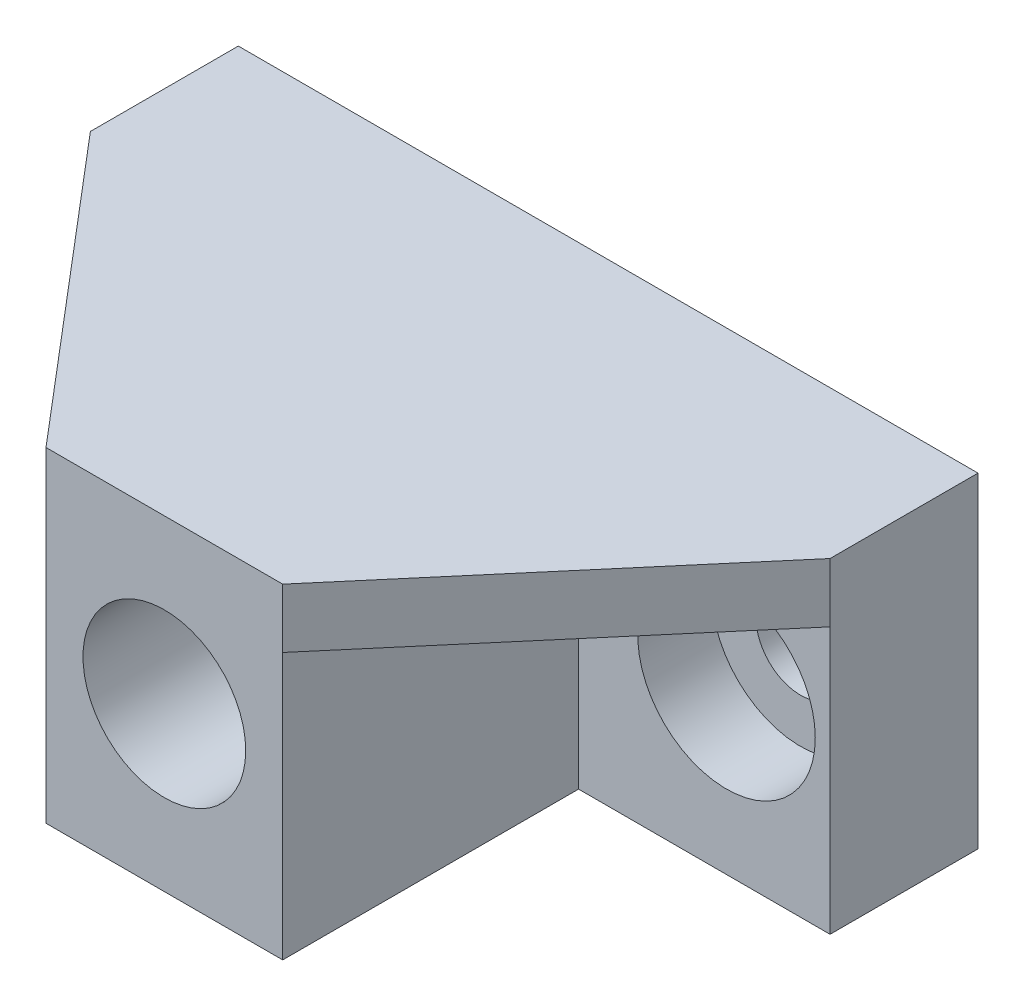
ISO-10303-21;
HEADER;
FILE_DESCRIPTION(('STEP AP214'),'2;1');
FILE_NAME('part.step','',(''),(''),'','','');
FILE_SCHEMA(('AUTOMOTIVE_DESIGN { 1 0 10303 214 1 1 1 1 }'));
ENDSEC;
DATA;
#1=APPLICATION_CONTEXT('core data for automotive mechanical design processes');
#2=APPLICATION_PROTOCOL_DEFINITION('international standard','automotive_design',2000,#1);
#3=PRODUCT_CONTEXT('',#1,'mechanical');
#4=PRODUCT('Part','Part','',(#3));
#5=PRODUCT_RELATED_PRODUCT_CATEGORY('part','',(#4));
#6=PRODUCT_DEFINITION_FORMATION('','',#4);
#7=PRODUCT_DEFINITION_CONTEXT('part definition',#1,'design');
#8=PRODUCT_DEFINITION('design','',#6,#7);
#9=PRODUCT_DEFINITION_SHAPE('','',#8);
#10=(LENGTH_UNIT() NAMED_UNIT(*) SI_UNIT(.MILLI.,.METRE.));
#11=(NAMED_UNIT(*) PLANE_ANGLE_UNIT() SI_UNIT($,.RADIAN.));
#12=(NAMED_UNIT(*) SI_UNIT($,.STERADIAN.) SOLID_ANGLE_UNIT());
#13=UNCERTAINTY_MEASURE_WITH_UNIT(LENGTH_MEASURE(1.E-05),#10,'distance_accuracy_value','');
#14=(GEOMETRIC_REPRESENTATION_CONTEXT(3) GLOBAL_UNCERTAINTY_ASSIGNED_CONTEXT((#13)) GLOBAL_UNIT_ASSIGNED_CONTEXT((#10,
#11,#12)) REPRESENTATION_CONTEXT('',''));
#15=CARTESIAN_POINT('',(0.,0.,0.));
#16=DIRECTION('',(0.,0.,1.));
#17=DIRECTION('',(1.,0.,0.));
#18=AXIS2_PLACEMENT_3D('',#15,#16,#17);
#19=CARTESIAN_POINT('',(0.,0.,10.));
#20=DIRECTION('',(0.,0.,1.));
#21=DIRECTION('',(1.,0.,0.));
#22=AXIS2_PLACEMENT_3D('',#19,#20,#21);
#23=PLANE('',#22);
#24=DIRECTION('',(-1.,0.,0.));
#25=VECTOR('',#24,1.);
#26=CARTESIAN_POINT('',(12.5,-9.49999999999999,10.));
#27=LINE('',#26,#25);
#28=CARTESIAN_POINT('',(12.5,-9.49999999999999,10.));
#29=VERTEX_POINT('',#28);
#30=CARTESIAN_POINT('',(-4.5,-9.49999999999999,10.));
#31=VERTEX_POINT('',#30);
#32=EDGE_CURVE('E225',#29,#31,#27,.T.);
#33=ORIENTED_EDGE('',*,*,#32,.F.);
#34=DIRECTION('',(0.,1.,0.));
#35=VECTOR('',#34,1.);
#36=CARTESIAN_POINT('',(12.5,0.,10.));
#37=LINE('',#36,#35);
#38=CARTESIAN_POINT('',(12.5,8.5,10.));
#39=VERTEX_POINT('',#38);
#40=EDGE_CURVE('E45',#29,#39,#37,.T.);
#41=ORIENTED_EDGE('',*,*,#40,.T.);
#42=DIRECTION('',(-1.,0.,0.));
#43=VECTOR('',#42,1.);
#44=CARTESIAN_POINT('',(-4.5,8.5,10.));
#45=LINE('',#44,#43);
#46=CARTESIAN_POINT('',(-4.5,8.5,10.));
#47=VERTEX_POINT('',#46);
#48=EDGE_CURVE('E159',#39,#47,#45,.T.);
#49=ORIENTED_EDGE('',*,*,#48,.T.);
#50=DIRECTION('',(0.,1.,0.));
#51=VECTOR('',#50,1.);
#52=CARTESIAN_POINT('',(-4.5,0.,10.));
#53=LINE('',#52,#51);
#54=EDGE_CURVE('E134',#31,#47,#53,.T.);
#55=ORIENTED_EDGE('',*,*,#54,.F.);
#56=EDGE_LOOP('',(#33,#41,#49,#55));
#57=FACE_BOUND('',#56,.T.);
#58=CARTESIAN_POINT('',(5.5,1.5,10.));
#59=DIRECTION('',(0.,0.,1.));
#60=DIRECTION('',(1.,0.,0.));
#61=AXIS2_PLACEMENT_3D('',#58,#59,#60);
#62=CIRCLE('',#61,6.);
#63=CARTESIAN_POINT('',(11.5,1.5,10.));
#64=VERTEX_POINT('',#63);
#65=EDGE_CURVE('E167',#64,#64,#62,.T.);
#66=ORIENTED_EDGE('',*,*,#65,.F.);
#67=EDGE_LOOP('',(#66));
#68=FACE_BOUND('',#67,.T.);
#69=ADVANCED_FACE('F37',(#57,#68),#23,.T.);
#70=CARTESIAN_POINT('',(0.,0.,0.));
#71=DIRECTION('',(0.,0.,1.));
#72=DIRECTION('',(1.,0.,0.));
#73=AXIS2_PLACEMENT_3D('',#70,#71,#72);
#74=PLANE('',#73);
#75=CARTESIAN_POINT('',(-12.5,1.5,0.));
#76=DIRECTION('',(0.,0.,1.));
#77=DIRECTION('',(1.,0.,0.));
#78=AXIS2_PLACEMENT_3D('',#75,#76,#77);
#79=CIRCLE('',#78,5.5);
#80=CARTESIAN_POINT('',(-7.,1.5,0.));
#81=VERTEX_POINT('',#80);
#82=EDGE_CURVE('E217',#81,#81,#79,.T.);
#83=ORIENTED_EDGE('',*,*,#82,.T.);
#84=EDGE_LOOP('',(#83));
#85=FACE_BOUND('',#84,.T.);
#86=CARTESIAN_POINT('',(5.5,1.5,0.));
#87=DIRECTION('',(0.,0.,1.));
#88=DIRECTION('',(1.,0.,0.));
#89=AXIS2_PLACEMENT_3D('',#86,#87,#88);
#90=CIRCLE('',#89,3.);
#91=CARTESIAN_POINT('',(8.5,1.5,0.));
#92=VERTEX_POINT('',#91);
#93=EDGE_CURVE('E170',#92,#92,#90,.T.);
#94=ORIENTED_EDGE('',*,*,#93,.T.);
#95=EDGE_LOOP('',(#94));
#96=FACE_BOUND('',#95,.T.);
#97=DIRECTION('',(0.,1.,0.));
#98=VECTOR('',#97,1.);
#99=CARTESIAN_POINT('',(12.5,0.,0.));
#100=LINE('',#99,#98);
#101=CARTESIAN_POINT('',(12.5,-9.49999999999999,0.));
#102=VERTEX_POINT('',#101);
#103=CARTESIAN_POINT('',(12.5,12.5,0.));
#104=VERTEX_POINT('',#103);
#105=EDGE_CURVE('E125',#102,#104,#100,.T.);
#106=ORIENTED_EDGE('',*,*,#105,.F.);
#107=DIRECTION('',(1.,0.,0.));
#108=VECTOR('',#107,1.);
#109=CARTESIAN_POINT('',(-37.5,-9.49999999999999,0.));
#110=LINE('',#109,#108);
#111=CARTESIAN_POINT('',(-37.5,-9.49999999999999,0.));
#112=VERTEX_POINT('',#111);
#113=EDGE_CURVE('E112',#112,#102,#110,.T.);
#114=ORIENTED_EDGE('',*,*,#113,.F.);
#115=DIRECTION('',(0.,1.,0.));
#116=VECTOR('',#115,1.);
#117=CARTESIAN_POINT('',(-37.5,0.,0.));
#118=LINE('',#117,#116);
#119=CARTESIAN_POINT('',(-37.5,12.5,0.));
#120=VERTEX_POINT('',#119);
#121=EDGE_CURVE('E181',#112,#120,#118,.T.);
#122=ORIENTED_EDGE('',*,*,#121,.T.);
#123=DIRECTION('',(1.,0.,0.));
#124=VECTOR('',#123,1.);
#125=CARTESIAN_POINT('',(0.,12.5,0.));
#126=LINE('',#125,#124);
#127=EDGE_CURVE('E132',#120,#104,#126,.T.);
#128=ORIENTED_EDGE('',*,*,#127,.T.);
#129=EDGE_LOOP('',(#106,#114,#122,#128));
#130=FACE_BOUND('',#129,.T.);
#131=CARTESIAN_POINT('',(-30.5,1.5,0.));
#132=DIRECTION('',(0.,0.,-1.));
#133=DIRECTION('',(-1.,0.,0.));
#134=AXIS2_PLACEMENT_3D('',#131,#132,#133);
#135=CIRCLE('',#134,3.);
#136=CARTESIAN_POINT('',(-33.5,1.5,0.));
#137=VERTEX_POINT('',#136);
#138=EDGE_CURVE('E211',#137,#137,#135,.T.);
#139=ORIENTED_EDGE('',*,*,#138,.F.);
#140=EDGE_LOOP('',(#139));
#141=FACE_BOUND('',#140,.T.);
#142=ADVANCED_FACE('F129',(#85,#96,#130,#141),#74,.F.);
#143=CARTESIAN_POINT('',(-30.5,1.5,5.));
#144=DIRECTION('',(0.,0.,1.));
#145=DIRECTION('',(-1.,0.,0.));
#146=AXIS2_PLACEMENT_3D('',#143,#144,#145);
#147=PLANE('',#146);
#148=CARTESIAN_POINT('',(-30.5,1.5,5.));
#149=DIRECTION('',(0.,0.,-1.));
#150=DIRECTION('',(-1.,0.,0.));
#151=AXIS2_PLACEMENT_3D('',#148,#149,#150);
#152=CIRCLE('',#151,6.);
#153=CARTESIAN_POINT('',(-36.5,1.49999999999999,5.));
#154=VERTEX_POINT('',#153);
#155=EDGE_CURVE('E200',#154,#154,#152,.T.);
#156=ORIENTED_EDGE('',*,*,#155,.F.);
#157=EDGE_LOOP('',(#156));
#158=FACE_BOUND('',#157,.T.);
#159=CARTESIAN_POINT('',(-30.5,1.5,5.));
#160=DIRECTION('',(0.,0.,-1.));
#161=DIRECTION('',(-1.,0.,0.));
#162=AXIS2_PLACEMENT_3D('',#159,#160,#161);
#163=CIRCLE('',#162,3.);
#164=CARTESIAN_POINT('',(-33.5,1.5,5.));
#165=VERTEX_POINT('',#164);
#166=EDGE_CURVE('E214',#165,#165,#163,.T.);
#167=ORIENTED_EDGE('',*,*,#166,.T.);
#168=EDGE_LOOP('',(#167));
#169=FACE_BOUND('',#168,.T.);
#170=ADVANCED_FACE('F262',(#158,#169),#147,.T.);
#171=CARTESIAN_POINT('',(-20.5,-9.49999999999999,10.));
#172=VERTEX_POINT('',#171);
#173=CARTESIAN_POINT('',(-37.5,-9.49999999999999,10.));
#174=VERTEX_POINT('',#173);
#175=EDGE_CURVE('E52',#172,#174,#27,.T.);
#176=ORIENTED_EDGE('',*,*,#175,.F.);
#177=DIRECTION('',(0.,1.,0.));
#178=VECTOR('',#177,1.);
#179=CARTESIAN_POINT('',(-20.5,0.,10.));
#180=LINE('',#179,#178);
#181=CARTESIAN_POINT('',(-20.5,8.5,10.));
#182=VERTEX_POINT('',#181);
#183=EDGE_CURVE('E183',#172,#182,#180,.T.);
#184=ORIENTED_EDGE('',*,*,#183,.T.);
#185=DIRECTION('',(1.,0.,0.));
#186=VECTOR('',#185,1.);
#187=CARTESIAN_POINT('',(-20.5,8.5,10.));
#188=LINE('',#187,#186);
#189=CARTESIAN_POINT('',(-37.5,8.49999999999999,10.));
#190=VERTEX_POINT('',#189);
#191=EDGE_CURVE('E199',#190,#182,#188,.T.);
#192=ORIENTED_EDGE('',*,*,#191,.F.);
#193=DIRECTION('',(0.,1.,0.));
#194=VECTOR('',#193,1.);
#195=CARTESIAN_POINT('',(-37.5,0.,10.));
#196=LINE('',#195,#194);
#197=EDGE_CURVE('E59',#174,#190,#196,.T.);
#198=ORIENTED_EDGE('',*,*,#197,.F.);
#199=EDGE_LOOP('',(#176,#184,#192,#198));
#200=FACE_BOUND('',#199,.T.);
#201=CARTESIAN_POINT('',(-30.5,1.5,10.));
#202=DIRECTION('',(0.,0.,-1.));
#203=DIRECTION('',(-1.,0.,0.));
#204=AXIS2_PLACEMENT_3D('',#201,#202,#203);
#205=CIRCLE('',#204,6.);
#206=CARTESIAN_POINT('',(-36.5,1.49999999999999,10.));
#207=VERTEX_POINT('',#206);
#208=EDGE_CURVE('E208',#207,#207,#205,.T.);
#209=ORIENTED_EDGE('',*,*,#208,.T.);
#210=EDGE_LOOP('',(#209));
#211=FACE_BOUND('',#210,.T.);
#212=ADVANCED_FACE('F259',(#200,#211),#23,.T.);
#213=CARTESIAN_POINT('',(-20.5,0.,30.));
#214=DIRECTION('',(1.,0.,0.));
#215=DIRECTION('',(0.,1.,0.));
#216=AXIS2_PLACEMENT_3D('',#213,#214,#215);
#217=PLANE('',#216);
#218=DIRECTION('',(0.,0.,1.));
#219=VECTOR('',#218,1.);
#220=CARTESIAN_POINT('',(-20.5,8.5,30.));
#221=LINE('',#220,#219);
#222=CARTESIAN_POINT('',(-20.5,8.5,30.));
#223=VERTEX_POINT('',#222);
#224=EDGE_CURVE('E195',#182,#223,#221,.T.);
#225=ORIENTED_EDGE('',*,*,#224,.F.);
#226=ORIENTED_EDGE('',*,*,#183,.F.);
#227=DIRECTION('',(0.,0.,-1.));
#228=VECTOR('',#227,1.);
#229=CARTESIAN_POINT('',(-20.5,-9.5,30.));
#230=LINE('',#229,#228);
#231=CARTESIAN_POINT('',(-20.5,-9.5,30.));
#232=VERTEX_POINT('',#231);
#233=EDGE_CURVE('E187',#232,#172,#230,.T.);
#234=ORIENTED_EDGE('',*,*,#233,.F.);
#235=DIRECTION('',(0.,-1.,0.));
#236=VECTOR('',#235,1.);
#237=CARTESIAN_POINT('',(-20.5,0.,30.));
#238=LINE('',#237,#236);
#239=EDGE_CURVE('E192',#223,#232,#238,.T.);
#240=ORIENTED_EDGE('',*,*,#239,.F.);
#241=EDGE_LOOP('',(#225,#226,#234,#240));
#242=FACE_BOUND('',#241,.T.);
#243=ADVANCED_FACE('F256',(#242),#217,.F.);
#244=CARTESIAN_POINT('',(-4.5,0.,30.));
#245=DIRECTION('',(1.,0.,0.));
#246=DIRECTION('',(0.,1.,0.));
#247=AXIS2_PLACEMENT_3D('',#244,#245,#246);
#248=PLANE('',#247);
#249=ORIENTED_EDGE('',*,*,#54,.T.);
#250=DIRECTION('',(0.,0.,1.));
#251=VECTOR('',#250,1.);
#252=CARTESIAN_POINT('',(-4.5,8.5,30.));
#253=LINE('',#252,#251);
#254=CARTESIAN_POINT('',(-4.5,8.5,30.));
#255=VERTEX_POINT('',#254);
#256=EDGE_CURVE('E163',#47,#255,#253,.T.);
#257=ORIENTED_EDGE('',*,*,#256,.T.);
#258=DIRECTION('',(0.,-1.,0.));
#259=VECTOR('',#258,1.);
#260=CARTESIAN_POINT('',(-4.5,0.,30.));
#261=LINE('',#260,#259);
#262=CARTESIAN_POINT('',(-4.5,-9.5,30.));
#263=VERTEX_POINT('',#262);
#264=EDGE_CURVE('E151',#255,#263,#261,.T.);
#265=ORIENTED_EDGE('',*,*,#264,.T.);
#266=DIRECTION('',(0.,0.,-1.));
#267=VECTOR('',#266,1.);
#268=CARTESIAN_POINT('',(-4.5,-9.5,30.));
#269=LINE('',#268,#267);
#270=EDGE_CURVE('E139',#263,#31,#269,.T.);
#271=ORIENTED_EDGE('',*,*,#270,.T.);
#272=EDGE_LOOP('',(#249,#257,#265,#271));
#273=FACE_BOUND('',#272,.T.);
#274=ADVANCED_FACE('F232',(#273),#248,.T.);
#275=CARTESIAN_POINT('',(0.,12.5,10.));
#276=DIRECTION('',(0.,1.,0.));
#277=DIRECTION('',(0.,0.,1.));
#278=AXIS2_PLACEMENT_3D('',#275,#276,#277);
#279=PLANE('',#278);
#280=DIRECTION('',(0.,0.,-1.));
#281=VECTOR('',#280,1.);
#282=CARTESIAN_POINT('',(-37.5,12.5,10.));
#283=LINE('',#282,#281);
#284=CARTESIAN_POINT('',(-37.5,12.5,10.));
#285=VERTEX_POINT('',#284);
#286=EDGE_CURVE('E176',#285,#120,#283,.T.);
#287=ORIENTED_EDGE('',*,*,#286,.F.);
#288=DIRECTION('',(-0.647648420095541,0.,-0.761939317759459));
#289=VECTOR('',#288,1.);
#290=CARTESIAN_POINT('',(-37.5,12.5,10.));
#291=LINE('',#290,#289);
#292=CARTESIAN_POINT('',(-20.5,12.5,30.));
#293=VERTEX_POINT('',#292);
#294=EDGE_CURVE('E196',#293,#285,#291,.T.);
#295=ORIENTED_EDGE('',*,*,#294,.F.);
#296=DIRECTION('',(1.,0.,0.));
#297=VECTOR('',#296,1.);
#298=CARTESIAN_POINT('',(0.,12.5,30.));
#299=LINE('',#298,#297);
#300=CARTESIAN_POINT('',(-4.5,12.5,30.));
#301=VERTEX_POINT('',#300);
#302=EDGE_CURVE('E145',#293,#301,#299,.T.);
#303=ORIENTED_EDGE('',*,*,#302,.T.);
#304=DIRECTION('',(0.647648420095541,0.,-0.761939317759459));
#305=VECTOR('',#304,1.);
#306=CARTESIAN_POINT('',(12.5,12.5,10.));
#307=LINE('',#306,#305);
#308=CARTESIAN_POINT('',(12.5,12.5,10.));
#309=VERTEX_POINT('',#308);
#310=EDGE_CURVE('E156',#301,#309,#307,.T.);
#311=ORIENTED_EDGE('',*,*,#310,.T.);
#312=DIRECTION('',(0.,0.,-1.));
#313=VECTOR('',#312,1.);
#314=CARTESIAN_POINT('',(12.5,12.5,10.));
#315=LINE('',#314,#313);
#316=EDGE_CURVE('E11',#309,#104,#315,.T.);
#317=ORIENTED_EDGE('',*,*,#316,.T.);
#318=ORIENTED_EDGE('',*,*,#127,.F.);
#319=EDGE_LOOP('',(#287,#295,#303,#311,#317,#318));
#320=FACE_BOUND('',#319,.T.);
#321=ADVANCED_FACE('F39',(#320),#279,.T.);
#322=CARTESIAN_POINT('',(12.5,0.,10.));
#323=DIRECTION('',(-1.,0.,0.));
#324=DIRECTION('',(0.,0.,1.));
#325=AXIS2_PLACEMENT_3D('',#322,#323,#324);
#326=PLANE('',#325);
#327=ORIENTED_EDGE('',*,*,#40,.F.);
#328=DIRECTION('',(0.,0.,1.));
#329=VECTOR('',#328,1.);
#330=CARTESIAN_POINT('',(12.5,-9.49999999999999,0.));
#331=LINE('',#330,#329);
#332=EDGE_CURVE('E115',#102,#29,#331,.T.);
#333=ORIENTED_EDGE('',*,*,#332,.F.);
#334=ORIENTED_EDGE('',*,*,#105,.T.);
#335=ORIENTED_EDGE('',*,*,#316,.F.);
#336=DIRECTION('',(0.,1.,0.));
#337=VECTOR('',#336,1.);
#338=CARTESIAN_POINT('',(12.5,8.5,10.));
#339=LINE('',#338,#337);
#340=EDGE_CURVE('E152',#39,#309,#339,.T.);
#341=ORIENTED_EDGE('',*,*,#340,.F.);
#342=EDGE_LOOP('',(#327,#333,#334,#335,#341));
#343=FACE_BOUND('',#342,.T.);
#344=ADVANCED_FACE('F124',(#343),#326,.F.);
#345=CARTESIAN_POINT('',(0.,-9.5,30.));
#346=DIRECTION('',(0.,1.,0.));
#347=DIRECTION('',(0.,0.,1.));
#348=AXIS2_PLACEMENT_3D('',#345,#346,#347);
#349=PLANE('',#348);
#350=ORIENTED_EDGE('',*,*,#233,.T.);
#351=ORIENTED_EDGE('',*,*,#175,.T.);
#352=DIRECTION('',(0.,0.,-1.));
#353=VECTOR('',#352,1.);
#354=CARTESIAN_POINT('',(-37.5,-9.49999999999999,10.));
#355=LINE('',#354,#353);
#356=EDGE_CURVE('E117',#174,#112,#355,.T.);
#357=ORIENTED_EDGE('',*,*,#356,.T.);
#358=ORIENTED_EDGE('',*,*,#113,.T.);
#359=ORIENTED_EDGE('',*,*,#332,.T.);
#360=ORIENTED_EDGE('',*,*,#32,.T.);
#361=ORIENTED_EDGE('',*,*,#270,.F.);
#362=DIRECTION('',(1.,0.,0.));
#363=VECTOR('',#362,1.);
#364=CARTESIAN_POINT('',(0.,-9.5,30.));
#365=LINE('',#364,#363);
#366=EDGE_CURVE('E142',#232,#263,#365,.T.);
#367=ORIENTED_EDGE('',*,*,#366,.F.);
#368=EDGE_LOOP('',(#350,#351,#357,#358,#359,#360,#361,#367));
#369=FACE_BOUND('',#368,.T.);
#370=ADVANCED_FACE('F114',(#369),#349,.F.);
#371=CARTESIAN_POINT('',(0.,0.,30.));
#372=DIRECTION('',(0.,0.,1.));
#373=DIRECTION('',(1.,0.,0.));
#374=AXIS2_PLACEMENT_3D('',#371,#372,#373);
#375=PLANE('',#374);
#376=CARTESIAN_POINT('',(-12.5,1.5,30.));
#377=DIRECTION('',(0.,0.,1.));
#378=DIRECTION('',(1.,0.,0.));
#379=AXIS2_PLACEMENT_3D('',#376,#377,#378);
#380=CIRCLE('',#379,5.5);
#381=CARTESIAN_POINT('',(-7.,1.5,30.));
#382=VERTEX_POINT('',#381);
#383=EDGE_CURVE('E220',#382,#382,#380,.T.);
#384=ORIENTED_EDGE('',*,*,#383,.F.);
#385=EDGE_LOOP('',(#384));
#386=FACE_BOUND('',#385,.T.);
#387=EDGE_CURVE('E148',#301,#255,#261,.T.);
#388=ORIENTED_EDGE('',*,*,#387,.F.);
#389=ORIENTED_EDGE('',*,*,#302,.F.);
#390=EDGE_CURVE('E189',#293,#223,#238,.T.);
#391=ORIENTED_EDGE('',*,*,#390,.T.);
#392=ORIENTED_EDGE('',*,*,#239,.T.);
#393=ORIENTED_EDGE('',*,*,#366,.T.);
#394=ORIENTED_EDGE('',*,*,#264,.F.);
#395=EDGE_LOOP('',(#388,#389,#391,#392,#393,#394));
#396=FACE_BOUND('',#395,.T.);
#397=ADVANCED_FACE('F243',(#386,#396),#375,.T.);
#398=CARTESIAN_POINT('',(12.5,8.5,10.));
#399=DIRECTION('',(0.761939317759459,0.,0.647648420095541));
#400=DIRECTION('',(0.647648420095541,0.,-0.761939317759459));
#401=AXIS2_PLACEMENT_3D('',#398,#399,#400);
#402=PLANE('',#401);
#403=ORIENTED_EDGE('',*,*,#310,.F.);
#404=ORIENTED_EDGE('',*,*,#387,.T.);
#405=DIRECTION('',(0.647648420095541,0.,-0.761939317759459));
#406=VECTOR('',#405,1.);
#407=CARTESIAN_POINT('',(12.5,8.5,10.));
#408=LINE('',#407,#406);
#409=EDGE_CURVE('E155',#255,#39,#408,.T.);
#410=ORIENTED_EDGE('',*,*,#409,.T.);
#411=ORIENTED_EDGE('',*,*,#340,.T.);
#412=EDGE_LOOP('',(#403,#404,#410,#411));
#413=FACE_BOUND('',#412,.T.);
#414=ADVANCED_FACE('F241',(#413),#402,.T.);
#415=CARTESIAN_POINT('',(0.,8.5,0.));
#416=DIRECTION('',(0.,1.,0.));
#417=DIRECTION('',(0.,0.,1.));
#418=AXIS2_PLACEMENT_3D('',#415,#416,#417);
#419=PLANE('',#418);
#420=ORIENTED_EDGE('',*,*,#48,.F.);
#421=ORIENTED_EDGE('',*,*,#409,.F.);
#422=ORIENTED_EDGE('',*,*,#256,.F.);
#423=EDGE_LOOP('',(#420,#421,#422));
#424=FACE_BOUND('',#423,.T.);
#425=ADVANCED_FACE('F238',(#424),#419,.F.);
#426=CARTESIAN_POINT('',(5.5,1.5,5.));
#427=DIRECTION('',(0.,0.,1.));
#428=DIRECTION('',(1.,0.,0.));
#429=AXIS2_PLACEMENT_3D('',#426,#427,#428);
#430=CYLINDRICAL_SURFACE('',#429,6.);
#431=CARTESIAN_POINT('',(5.5,1.5,5.));
#432=DIRECTION('',(0.,0.,1.));
#433=DIRECTION('',(1.,0.,0.));
#434=AXIS2_PLACEMENT_3D('',#431,#432,#433);
#435=CIRCLE('',#434,6.);
#436=CARTESIAN_POINT('',(11.5,1.5,5.));
#437=VERTEX_POINT('',#436);
#438=EDGE_CURVE('E160',#437,#437,#435,.T.);
#439=ORIENTED_EDGE('',*,*,#438,.F.);
#440=EDGE_LOOP('',(#439));
#441=FACE_BOUND('',#440,.T.);
#442=ORIENTED_EDGE('',*,*,#65,.T.);
#443=EDGE_LOOP('',(#442));
#444=FACE_BOUND('',#443,.T.);
#445=ADVANCED_FACE('F314',(#441,#444),#430,.F.);
#446=CARTESIAN_POINT('',(5.5,1.5,5.));
#447=DIRECTION('',(0.,0.,1.));
#448=DIRECTION('',(1.,0.,0.));
#449=AXIS2_PLACEMENT_3D('',#446,#447,#448);
#450=PLANE('',#449);
#451=CARTESIAN_POINT('',(5.5,1.5,5.));
#452=DIRECTION('',(0.,0.,1.));
#453=DIRECTION('',(1.,0.,0.));
#454=AXIS2_PLACEMENT_3D('',#451,#452,#453);
#455=CIRCLE('',#454,3.);
#456=CARTESIAN_POINT('',(8.5,1.5,5.));
#457=VERTEX_POINT('',#456);
#458=EDGE_CURVE('E173',#457,#457,#455,.T.);
#459=ORIENTED_EDGE('',*,*,#458,.F.);
#460=EDGE_LOOP('',(#459));
#461=FACE_BOUND('',#460,.T.);
#462=ORIENTED_EDGE('',*,*,#438,.T.);
#463=EDGE_LOOP('',(#462));
#464=FACE_BOUND('',#463,.T.);
#465=ADVANCED_FACE('F310',(#461,#464),#450,.T.);
#466=CARTESIAN_POINT('',(5.5,1.5,0.));
#467=DIRECTION('',(0.,0.,1.));
#468=DIRECTION('',(1.,0.,0.));
#469=AXIS2_PLACEMENT_3D('',#466,#467,#468);
#470=CYLINDRICAL_SURFACE('',#469,3.);
#471=ORIENTED_EDGE('',*,*,#93,.F.);
#472=EDGE_LOOP('',(#471));
#473=FACE_BOUND('',#472,.T.);
#474=ORIENTED_EDGE('',*,*,#458,.T.);
#475=EDGE_LOOP('',(#474));
#476=FACE_BOUND('',#475,.T.);
#477=ADVANCED_FACE('F307',(#473,#476),#470,.F.);
#478=CARTESIAN_POINT('',(-37.5,0.,10.));
#479=DIRECTION('',(-1.,0.,0.));
#480=DIRECTION('',(0.,-1.,0.));
#481=AXIS2_PLACEMENT_3D('',#478,#479,#480);
#482=PLANE('',#481);
#483=ORIENTED_EDGE('',*,*,#356,.F.);
#484=ORIENTED_EDGE('',*,*,#197,.T.);
#485=DIRECTION('',(0.,1.,0.));
#486=VECTOR('',#485,1.);
#487=CARTESIAN_POINT('',(-37.5,8.49999999999999,10.));
#488=LINE('',#487,#486);
#489=EDGE_CURVE('E193',#190,#285,#488,.T.);
#490=ORIENTED_EDGE('',*,*,#489,.T.);
#491=ORIENTED_EDGE('',*,*,#286,.T.);
#492=ORIENTED_EDGE('',*,*,#121,.F.);
#493=EDGE_LOOP('',(#483,#484,#490,#491,#492));
#494=FACE_BOUND('',#493,.T.);
#495=ADVANCED_FACE('F304',(#494),#482,.T.);
#496=CARTESIAN_POINT('',(-37.5,8.49999999999999,10.));
#497=DIRECTION('',(0.761939317759459,0.,-0.647648420095541));
#498=DIRECTION('',(-0.647648420095541,0.,-0.761939317759459));
#499=AXIS2_PLACEMENT_3D('',#496,#497,#498);
#500=PLANE('',#499);
#501=ORIENTED_EDGE('',*,*,#294,.T.);
#502=ORIENTED_EDGE('',*,*,#489,.F.);
#503=DIRECTION('',(-0.647648420095541,0.,-0.761939317759459));
#504=VECTOR('',#503,1.);
#505=CARTESIAN_POINT('',(-37.5,8.49999999999999,10.));
#506=LINE('',#505,#504);
#507=EDGE_CURVE('E203',#223,#190,#506,.T.);
#508=ORIENTED_EDGE('',*,*,#507,.F.);
#509=ORIENTED_EDGE('',*,*,#390,.F.);
#510=EDGE_LOOP('',(#501,#502,#508,#509));
#511=FACE_BOUND('',#510,.T.);
#512=ADVANCED_FACE('F250',(#511),#500,.F.);
#513=CARTESIAN_POINT('',(-25.,8.5,0.));
#514=DIRECTION('',(0.,1.,0.));
#515=DIRECTION('',(0.,0.,1.));
#516=AXIS2_PLACEMENT_3D('',#513,#514,#515);
#517=PLANE('',#516);
#518=ORIENTED_EDGE('',*,*,#191,.T.);
#519=ORIENTED_EDGE('',*,*,#224,.T.);
#520=ORIENTED_EDGE('',*,*,#507,.T.);
#521=EDGE_LOOP('',(#518,#519,#520));
#522=FACE_BOUND('',#521,.T.);
#523=ADVANCED_FACE('F253',(#522),#517,.F.);
#524=CARTESIAN_POINT('',(-30.5,1.5,5.));
#525=DIRECTION('',(0.,0.,1.));
#526=DIRECTION('',(1.,0.,0.));
#527=AXIS2_PLACEMENT_3D('',#524,#525,#526);
#528=CYLINDRICAL_SURFACE('',#527,6.);
#529=ORIENTED_EDGE('',*,*,#155,.T.);
#530=EDGE_LOOP('',(#529));
#531=FACE_BOUND('',#530,.T.);
#532=ORIENTED_EDGE('',*,*,#208,.F.);
#533=EDGE_LOOP('',(#532));
#534=FACE_BOUND('',#533,.T.);
#535=ADVANCED_FACE('F266',(#531,#534),#528,.F.);
#536=CARTESIAN_POINT('',(-30.5,1.5,0.));
#537=DIRECTION('',(0.,0.,1.));
#538=DIRECTION('',(1.,0.,0.));
#539=AXIS2_PLACEMENT_3D('',#536,#537,#538);
#540=CYLINDRICAL_SURFACE('',#539,3.);
#541=ORIENTED_EDGE('',*,*,#138,.T.);
#542=EDGE_LOOP('',(#541));
#543=FACE_BOUND('',#542,.T.);
#544=ORIENTED_EDGE('',*,*,#166,.F.);
#545=EDGE_LOOP('',(#544));
#546=FACE_BOUND('',#545,.T.);
#547=ADVANCED_FACE('F268',(#543,#546),#540,.F.);
#548=CARTESIAN_POINT('',(-12.5,1.5,0.));
#549=DIRECTION('',(0.,0.,1.));
#550=DIRECTION('',(1.,0.,0.));
#551=AXIS2_PLACEMENT_3D('',#548,#549,#550);
#552=CYLINDRICAL_SURFACE('',#551,5.5);
#553=ORIENTED_EDGE('',*,*,#82,.F.);
#554=EDGE_LOOP('',(#553));
#555=FACE_BOUND('',#554,.T.);
#556=ORIENTED_EDGE('',*,*,#383,.T.);
#557=EDGE_LOOP('',(#556));
#558=FACE_BOUND('',#557,.T.);
#559=ADVANCED_FACE('F275',(#555,#558),#552,.F.);
#560=CLOSED_SHELL('',(#69,#142,#170,#212,#243,#274,#321,#344,#370,#397,#414,#425,#445,#465,#477,
#495,#512,#523,#535,#547,#559));
#561=MANIFOLD_SOLID_BREP('B2',#560);
#562=ADVANCED_BREP_SHAPE_REPRESENTATION('',(#18,#561),#14);
#563=SHAPE_DEFINITION_REPRESENTATION(#9,#562);
ENDSEC;
END-ISO-10303-21;
